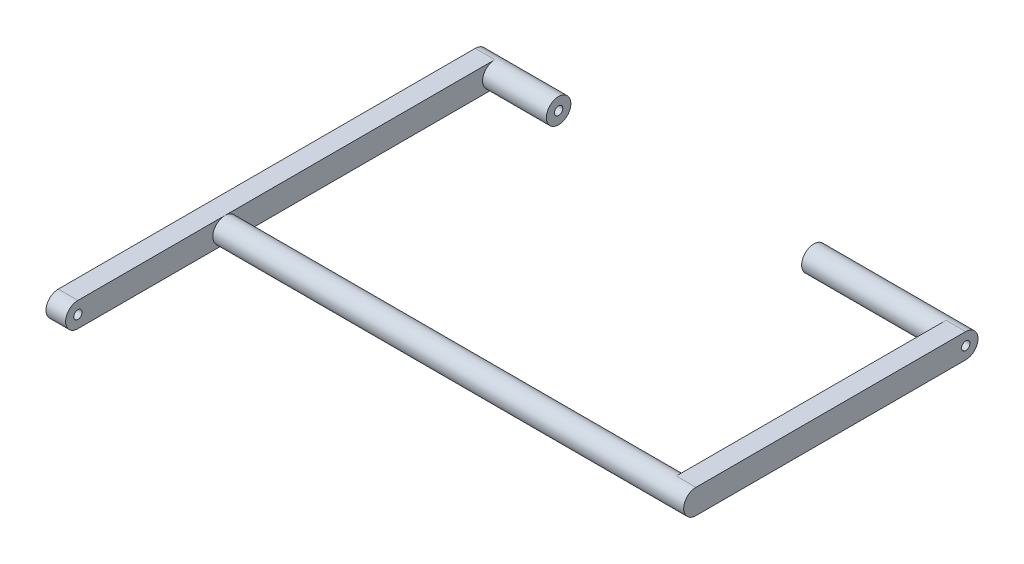
ISO-10303-21;
HEADER;
FILE_DESCRIPTION(('STEP AP214'),'2;1');
FILE_NAME('part.step','',(''),(''),'','','');
FILE_SCHEMA(('AUTOMOTIVE_DESIGN { 1 0 10303 214 1 1 1 1 }'));
ENDSEC;
DATA;
#1=APPLICATION_CONTEXT('core data for automotive mechanical design processes');
#2=APPLICATION_PROTOCOL_DEFINITION('international standard','automotive_design',2000,#1);
#3=PRODUCT_CONTEXT('',#1,'mechanical');
#4=PRODUCT('Part','Part','',(#3));
#5=PRODUCT_RELATED_PRODUCT_CATEGORY('part','',(#4));
#6=PRODUCT_DEFINITION_FORMATION('','',#4);
#7=PRODUCT_DEFINITION_CONTEXT('part definition',#1,'design');
#8=PRODUCT_DEFINITION('design','',#6,#7);
#9=PRODUCT_DEFINITION_SHAPE('','',#8);
#10=(LENGTH_UNIT() NAMED_UNIT(*) SI_UNIT(.MILLI.,.METRE.));
#11=(NAMED_UNIT(*) PLANE_ANGLE_UNIT() SI_UNIT($,.RADIAN.));
#12=(NAMED_UNIT(*) SI_UNIT($,.STERADIAN.) SOLID_ANGLE_UNIT());
#13=UNCERTAINTY_MEASURE_WITH_UNIT(LENGTH_MEASURE(1.E-05),#10,'distance_accuracy_value','');
#14=(GEOMETRIC_REPRESENTATION_CONTEXT(3) GLOBAL_UNCERTAINTY_ASSIGNED_CONTEXT((#13)) GLOBAL_UNIT_ASSIGNED_CONTEXT((#10,
#11,#12)) REPRESENTATION_CONTEXT('',''));
#15=CARTESIAN_POINT('',(0.,0.,0.));
#16=DIRECTION('',(0.,0.,1.));
#17=DIRECTION('',(1.,0.,0.));
#18=AXIS2_PLACEMENT_3D('',#15,#16,#17);
#19=CARTESIAN_POINT('',(4.,0.,27.5));
#20=DIRECTION('',(-1.,0.,0.));
#21=DIRECTION('',(0.,0.,1.));
#22=AXIS2_PLACEMENT_3D('',#19,#20,#21);
#23=CYLINDRICAL_SURFACE('',#22,2.5);
#24=DIRECTION('',(-1.,0.,0.));
#25=VECTOR('',#24,1.);
#26=CARTESIAN_POINT('',(4.,2.5,27.5));
#27=LINE('',#26,#25);
#28=CARTESIAN_POINT('',(4.,2.5,27.5));
#29=VERTEX_POINT('',#28);
#30=CARTESIAN_POINT('',(0.,2.5,27.5));
#31=VERTEX_POINT('',#30);
#32=EDGE_CURVE('E97',#29,#31,#27,.T.);
#33=ORIENTED_EDGE('',*,*,#32,.T.);
#34=CARTESIAN_POINT('',(0.,0.,27.5));
#35=DIRECTION('',(-1.,0.,0.));
#36=DIRECTION('',(0.,0.,1.));
#37=AXIS2_PLACEMENT_3D('',#34,#35,#36);
#38=CIRCLE('',#37,2.5);
#39=CARTESIAN_POINT('',(0.,-2.5,27.5));
#40=VERTEX_POINT('',#39);
#41=EDGE_CURVE('E173',#31,#40,#38,.T.);
#42=ORIENTED_EDGE('',*,*,#41,.T.);
#43=DIRECTION('',(-1.,0.,0.));
#44=VECTOR('',#43,1.);
#45=CARTESIAN_POINT('',(4.,-2.5,27.5));
#46=LINE('',#45,#44);
#47=CARTESIAN_POINT('',(4.,-2.5,27.5));
#48=VERTEX_POINT('',#47);
#49=EDGE_CURVE('E41',#48,#40,#46,.T.);
#50=ORIENTED_EDGE('',*,*,#49,.F.);
#51=CARTESIAN_POINT('',(4.,0.,27.5));
#52=DIRECTION('',(1.,0.,0.));
#53=DIRECTION('',(0.,0.,-1.));
#54=AXIS2_PLACEMENT_3D('',#51,#52,#53);
#55=CIRCLE('',#54,2.5);
#56=EDGE_CURVE('E83',#29,#48,#55,.T.);
#57=ORIENTED_EDGE('',*,*,#56,.F.);
#58=EDGE_LOOP('',(#33,#42,#50,#57));
#59=FACE_BOUND('',#58,.T.);
#60=CARTESIAN_POINT('',(-92.,0.,27.5));
#61=DIRECTION('',(-1.,0.,0.));
#62=DIRECTION('',(0.,0.,1.));
#63=AXIS2_PLACEMENT_3D('',#60,#61,#62);
#64=CIRCLE('',#63,2.5);
#65=CARTESIAN_POINT('',(-92.,2.5,27.5));
#66=VERTEX_POINT('',#65);
#67=CARTESIAN_POINT('',(-92.,-2.5,27.5));
#68=VERTEX_POINT('',#67);
#69=EDGE_CURVE('E174',#66,#68,#64,.T.);
#70=ORIENTED_EDGE('',*,*,#69,.F.);
#71=CARTESIAN_POINT('',(-92.,0.,27.5));
#72=DIRECTION('',(1.,0.,0.));
#73=DIRECTION('',(0.,0.,-1.));
#74=AXIS2_PLACEMENT_3D('',#71,#72,#73);
#75=CIRCLE('',#74,2.5);
#76=EDGE_CURVE('E141',#66,#68,#75,.T.);
#77=ORIENTED_EDGE('',*,*,#76,.T.);
#78=EDGE_LOOP('',(#70,#77));
#79=FACE_BOUND('',#78,.T.);
#80=ADVANCED_FACE('F32',(#59,#79),#23,.T.);
#81=CARTESIAN_POINT('',(4.,-2.5,27.5));
#82=DIRECTION('',(0.,1.,0.));
#83=DIRECTION('',(0.,0.,1.));
#84=AXIS2_PLACEMENT_3D('',#81,#82,#83);
#85=PLANE('',#84);
#86=DIRECTION('',(0.,0.,-1.));
#87=VECTOR('',#86,1.);
#88=CARTESIAN_POINT('',(0.,-2.5,27.5));
#89=LINE('',#88,#87);
#90=CARTESIAN_POINT('',(0.,-2.49999999999999,-27.5));
#91=VERTEX_POINT('',#90);
#92=EDGE_CURVE('E90',#40,#91,#89,.T.);
#93=ORIENTED_EDGE('',*,*,#92,.T.);
#94=DIRECTION('',(-1.,0.,0.));
#95=VECTOR('',#94,1.);
#96=CARTESIAN_POINT('',(4.,-2.49999999999999,-27.5));
#97=LINE('',#96,#95);
#98=CARTESIAN_POINT('',(4.,-2.49999999999999,-27.5));
#99=VERTEX_POINT('',#98);
#100=EDGE_CURVE('E88',#99,#91,#97,.T.);
#101=ORIENTED_EDGE('',*,*,#100,.F.);
#102=DIRECTION('',(0.,0.,-1.));
#103=VECTOR('',#102,1.);
#104=CARTESIAN_POINT('',(4.,-2.5,27.5));
#105=LINE('',#104,#103);
#106=EDGE_CURVE('E76',#48,#99,#105,.T.);
#107=ORIENTED_EDGE('',*,*,#106,.F.);
#108=ORIENTED_EDGE('',*,*,#49,.T.);
#109=EDGE_LOOP('',(#93,#101,#107,#108));
#110=FACE_BOUND('',#109,.T.);
#111=ADVANCED_FACE('F89',(#110),#85,.F.);
#112=CARTESIAN_POINT('',(4.,0.,-27.5));
#113=DIRECTION('',(-1.,0.,0.));
#114=DIRECTION('',(0.,0.,1.));
#115=AXIS2_PLACEMENT_3D('',#112,#113,#114);
#116=CYLINDRICAL_SURFACE('',#115,2.5);
#117=ORIENTED_EDGE('',*,*,#100,.T.);
#118=CARTESIAN_POINT('',(0.,0.,-27.5));
#119=DIRECTION('',(-1.,0.,0.));
#120=DIRECTION('',(0.,0.,1.));
#121=AXIS2_PLACEMENT_3D('',#118,#119,#120);
#122=CIRCLE('',#121,2.5);
#123=CARTESIAN_POINT('',(0.,2.50000000000001,-27.5));
#124=VERTEX_POINT('',#123);
#125=EDGE_CURVE('E11',#91,#124,#122,.T.);
#126=ORIENTED_EDGE('',*,*,#125,.T.);
#127=DIRECTION('',(-1.,0.,0.));
#128=VECTOR('',#127,1.);
#129=CARTESIAN_POINT('',(4.,2.50000000000001,-27.5));
#130=LINE('',#129,#128);
#131=CARTESIAN_POINT('',(4.,2.50000000000001,-27.5));
#132=VERTEX_POINT('',#131);
#133=EDGE_CURVE('E92',#132,#124,#130,.T.);
#134=ORIENTED_EDGE('',*,*,#133,.F.);
#135=CARTESIAN_POINT('',(4.,0.,-27.5));
#136=DIRECTION('',(1.,0.,0.));
#137=DIRECTION('',(0.,0.,-1.));
#138=AXIS2_PLACEMENT_3D('',#135,#136,#137);
#139=CIRCLE('',#138,2.5);
#140=EDGE_CURVE('E80',#99,#132,#139,.T.);
#141=ORIENTED_EDGE('',*,*,#140,.F.);
#142=EDGE_LOOP('',(#117,#126,#134,#141));
#143=FACE_BOUND('',#142,.T.);
#144=CARTESIAN_POINT('',(-26.96,0.,-27.5));
#145=DIRECTION('',(-1.,0.,0.));
#146=DIRECTION('',(0.,0.,1.));
#147=AXIS2_PLACEMENT_3D('',#144,#145,#146);
#148=CIRCLE('',#147,2.5);
#149=CARTESIAN_POINT('',(-26.96,0.,-25.));
#150=VERTEX_POINT('',#149);
#151=EDGE_CURVE('E102',#150,#150,#148,.T.);
#152=ORIENTED_EDGE('',*,*,#151,.F.);
#153=EDGE_LOOP('',(#152));
#154=FACE_BOUND('',#153,.T.);
#155=ADVANCED_FACE('F94',(#143,#154),#116,.T.);
#156=CARTESIAN_POINT('',(4.,2.5,27.5));
#157=DIRECTION('',(0.,-1.,0.));
#158=DIRECTION('',(0.,0.,-1.));
#159=AXIS2_PLACEMENT_3D('',#156,#157,#158);
#160=PLANE('',#159);
#161=DIRECTION('',(0.,0.,1.));
#162=VECTOR('',#161,1.);
#163=CARTESIAN_POINT('',(0.,2.5,27.5));
#164=LINE('',#163,#162);
#165=EDGE_CURVE('E67',#124,#31,#164,.T.);
#166=ORIENTED_EDGE('',*,*,#165,.T.);
#167=ORIENTED_EDGE('',*,*,#32,.F.);
#168=DIRECTION('',(0.,0.,1.));
#169=VECTOR('',#168,1.);
#170=CARTESIAN_POINT('',(4.,2.5,27.5));
#171=LINE('',#170,#169);
#172=EDGE_CURVE('E50',#132,#29,#171,.T.);
#173=ORIENTED_EDGE('',*,*,#172,.F.);
#174=ORIENTED_EDGE('',*,*,#133,.T.);
#175=EDGE_LOOP('',(#166,#167,#173,#174));
#176=FACE_BOUND('',#175,.T.);
#177=ADVANCED_FACE('F184',(#176),#160,.F.);
#178=CARTESIAN_POINT('',(4.,0.,27.5));
#179=DIRECTION('',(1.,0.,0.));
#180=DIRECTION('',(0.,0.,-1.));
#181=AXIS2_PLACEMENT_3D('',#178,#179,#180);
#182=PLANE('',#181);
#183=CARTESIAN_POINT('',(4.,0.,-27.5));
#184=DIRECTION('',(-1.,0.,0.));
#185=DIRECTION('',(0.,0.,1.));
#186=AXIS2_PLACEMENT_3D('',#183,#184,#185);
#187=CIRCLE('',#186,0.850000000000007);
#188=CARTESIAN_POINT('',(4.,0.,-26.65));
#189=VERTEX_POINT('',#188);
#190=EDGE_CURVE('E110',#189,#189,#187,.T.);
#191=ORIENTED_EDGE('',*,*,#190,.T.);
#192=EDGE_LOOP('',(#191));
#193=FACE_BOUND('',#192,.T.);
#194=ORIENTED_EDGE('',*,*,#56,.T.);
#195=ORIENTED_EDGE('',*,*,#106,.T.);
#196=ORIENTED_EDGE('',*,*,#140,.T.);
#197=ORIENTED_EDGE('',*,*,#172,.T.);
#198=EDGE_LOOP('',(#194,#195,#196,#197));
#199=FACE_BOUND('',#198,.T.);
#200=ADVANCED_FACE('F78',(#193,#199),#182,.T.);
#201=CARTESIAN_POINT('',(0.,0.,27.5));
#202=DIRECTION('',(1.,0.,0.));
#203=DIRECTION('',(0.,0.,-1.));
#204=AXIS2_PLACEMENT_3D('',#201,#202,#203);
#205=PLANE('',#204);
#206=ORIENTED_EDGE('',*,*,#41,.F.);
#207=ORIENTED_EDGE('',*,*,#165,.F.);
#208=ORIENTED_EDGE('',*,*,#125,.F.);
#209=ORIENTED_EDGE('',*,*,#92,.F.);
#210=EDGE_LOOP('',(#206,#207,#208,#209));
#211=FACE_BOUND('',#210,.T.);
#212=ADVANCED_FACE('F272',(#211),#205,.F.);
#213=CARTESIAN_POINT('',(-26.96,0.,-27.5));
#214=DIRECTION('',(-1.,0.,0.));
#215=DIRECTION('',(0.,0.,1.));
#216=AXIS2_PLACEMENT_3D('',#213,#214,#215);
#217=PLANE('',#216);
#218=CARTESIAN_POINT('',(-26.96,0.,-27.5));
#219=DIRECTION('',(-1.,0.,0.));
#220=DIRECTION('',(0.,0.,1.));
#221=AXIS2_PLACEMENT_3D('',#218,#219,#220);
#222=CIRCLE('',#221,0.850000000000007);
#223=CARTESIAN_POINT('',(-26.96,0.,-26.65));
#224=VERTEX_POINT('',#223);
#225=EDGE_CURVE('E109',#224,#224,#222,.T.);
#226=ORIENTED_EDGE('',*,*,#225,.F.);
#227=EDGE_LOOP('',(#226));
#228=FACE_BOUND('',#227,.T.);
#229=ORIENTED_EDGE('',*,*,#151,.T.);
#230=EDGE_LOOP('',(#229));
#231=FACE_BOUND('',#230,.T.);
#232=ADVANCED_FACE('F182',(#228,#231),#217,.T.);
#233=CARTESIAN_POINT('',(-92.,0.,27.5));
#234=DIRECTION('',(-1.,0.,0.));
#235=DIRECTION('',(0.,0.,1.));
#236=AXIS2_PLACEMENT_3D('',#233,#234,#235);
#237=PLANE('',#236);
#238=CARTESIAN_POINT('',(-92.,0.,-27.5));
#239=DIRECTION('',(1.,0.,0.));
#240=DIRECTION('',(0.,0.,-1.));
#241=AXIS2_PLACEMENT_3D('',#238,#239,#240);
#242=CIRCLE('',#241,2.50000000000001);
#243=CARTESIAN_POINT('',(-92.,2.50000000000002,-27.5));
#244=VERTEX_POINT('',#243);
#245=CARTESIAN_POINT('',(-92.,-2.50000000000001,-27.5));
#246=VERTEX_POINT('',#245);
#247=EDGE_CURVE('E146',#244,#246,#242,.T.);
#248=ORIENTED_EDGE('',*,*,#247,.F.);
#249=DIRECTION('',(0.,0.,-1.));
#250=VECTOR('',#249,1.);
#251=CARTESIAN_POINT('',(-92.,2.5,27.5));
#252=LINE('',#251,#250);
#253=EDGE_CURVE('E150',#66,#244,#252,.T.);
#254=ORIENTED_EDGE('',*,*,#253,.F.);
#255=ORIENTED_EDGE('',*,*,#69,.T.);
#256=DIRECTION('',(0.,0.,1.));
#257=VECTOR('',#256,1.);
#258=CARTESIAN_POINT('',(-92.,-2.5,27.5));
#259=LINE('',#258,#257);
#260=EDGE_CURVE('E157',#246,#68,#259,.T.);
#261=ORIENTED_EDGE('',*,*,#260,.F.);
#262=EDGE_LOOP('',(#248,#254,#255,#261));
#263=FACE_BOUND('',#262,.T.);
#264=ADVANCED_FACE('F208',(#263),#237,.F.);
#265=CARTESIAN_POINT('',(-96.,2.5,27.5));
#266=DIRECTION('',(0.,-1.,0.));
#267=DIRECTION('',(0.,0.,-1.));
#268=AXIS2_PLACEMENT_3D('',#265,#266,#267);
#269=PLANE('',#268);
#270=ORIENTED_EDGE('',*,*,#253,.T.);
#271=DIRECTION('',(1.,0.,0.));
#272=VECTOR('',#271,1.);
#273=CARTESIAN_POINT('',(-96.,2.50000000000001,-27.5));
#274=LINE('',#273,#272);
#275=CARTESIAN_POINT('',(-96.,2.50000000000001,-27.5));
#276=VERTEX_POINT('',#275);
#277=EDGE_CURVE('E170',#276,#244,#274,.T.);
#278=ORIENTED_EDGE('',*,*,#277,.F.);
#279=DIRECTION('',(0.,0.,-1.));
#280=VECTOR('',#279,1.);
#281=CARTESIAN_POINT('',(-96.,2.5,27.5));
#282=LINE('',#281,#280);
#283=CARTESIAN_POINT('',(-96.,2.5,57.5));
#284=VERTEX_POINT('',#283);
#285=EDGE_CURVE('E153',#284,#276,#282,.T.);
#286=ORIENTED_EDGE('',*,*,#285,.F.);
#287=DIRECTION('',(1.,0.,0.));
#288=VECTOR('',#287,1.);
#289=CARTESIAN_POINT('',(-131.355339059327,2.5,57.5));
#290=LINE('',#289,#288);
#291=CARTESIAN_POINT('',(-92.,2.5,57.5));
#292=VERTEX_POINT('',#291);
#293=EDGE_CURVE('E129',#284,#292,#290,.T.);
#294=ORIENTED_EDGE('',*,*,#293,.T.);
#295=DIRECTION('',(0.,0.,1.));
#296=VECTOR('',#295,1.);
#297=CARTESIAN_POINT('',(-92.,2.5,27.5));
#298=LINE('',#297,#296);
#299=EDGE_CURVE('E114',#66,#292,#298,.T.);
#300=ORIENTED_EDGE('',*,*,#299,.F.);
#301=EDGE_LOOP('',(#270,#278,#286,#294,#300));
#302=FACE_BOUND('',#301,.T.);
#303=ADVANCED_FACE('F216',(#302),#269,.F.);
#304=CARTESIAN_POINT('',(-96.,0.,-27.5));
#305=DIRECTION('',(1.,0.,0.));
#306=DIRECTION('',(0.,0.,-1.));
#307=AXIS2_PLACEMENT_3D('',#304,#305,#306);
#308=CYLINDRICAL_SURFACE('',#307,2.5);
#309=ORIENTED_EDGE('',*,*,#277,.T.);
#310=ORIENTED_EDGE('',*,*,#247,.T.);
#311=DIRECTION('',(1.,0.,0.));
#312=VECTOR('',#311,1.);
#313=CARTESIAN_POINT('',(-96.,-2.50000000000001,-27.5));
#314=LINE('',#313,#312);
#315=CARTESIAN_POINT('',(-96.,-2.50000000000001,-27.5));
#316=VERTEX_POINT('',#315);
#317=EDGE_CURVE('E163',#316,#246,#314,.T.);
#318=ORIENTED_EDGE('',*,*,#317,.F.);
#319=CARTESIAN_POINT('',(-96.,0.,-27.5));
#320=DIRECTION('',(-1.,0.,0.));
#321=DIRECTION('',(0.,0.,1.));
#322=AXIS2_PLACEMENT_3D('',#319,#320,#321);
#323=CIRCLE('',#322,2.5);
#324=EDGE_CURVE('E156',#276,#316,#323,.T.);
#325=ORIENTED_EDGE('',*,*,#324,.F.);
#326=EDGE_LOOP('',(#309,#310,#318,#325));
#327=FACE_BOUND('',#326,.T.);
#328=CARTESIAN_POINT('',(-79.,0.,-27.5));
#329=DIRECTION('',(1.,0.,0.));
#330=DIRECTION('',(0.,0.,-1.));
#331=AXIS2_PLACEMENT_3D('',#328,#329,#330);
#332=CIRCLE('',#331,2.50000000000001);
#333=CARTESIAN_POINT('',(-79.,0.,-30.));
#334=VERTEX_POINT('',#333);
#335=EDGE_CURVE('E147',#334,#334,#332,.T.);
#336=ORIENTED_EDGE('',*,*,#335,.F.);
#337=EDGE_LOOP('',(#336));
#338=FACE_BOUND('',#337,.T.);
#339=ADVANCED_FACE('F244',(#327,#338),#308,.T.);
#340=CARTESIAN_POINT('',(-96.,-2.5,27.5));
#341=DIRECTION('',(0.,1.,0.));
#342=DIRECTION('',(0.,0.,1.));
#343=AXIS2_PLACEMENT_3D('',#340,#341,#342);
#344=PLANE('',#343);
#345=ORIENTED_EDGE('',*,*,#260,.T.);
#346=DIRECTION('',(0.,0.,-1.));
#347=VECTOR('',#346,1.);
#348=CARTESIAN_POINT('',(-92.,-2.5,27.5));
#349=LINE('',#348,#347);
#350=CARTESIAN_POINT('',(-92.,-2.5,57.5));
#351=VERTEX_POINT('',#350);
#352=EDGE_CURVE('E126',#351,#68,#349,.T.);
#353=ORIENTED_EDGE('',*,*,#352,.F.);
#354=DIRECTION('',(1.,0.,0.));
#355=VECTOR('',#354,1.);
#356=CARTESIAN_POINT('',(-131.355339059327,-2.5,57.5));
#357=LINE('',#356,#355);
#358=CARTESIAN_POINT('',(-96.,-2.5,57.5));
#359=VERTEX_POINT('',#358);
#360=EDGE_CURVE('E138',#359,#351,#357,.T.);
#361=ORIENTED_EDGE('',*,*,#360,.F.);
#362=DIRECTION('',(0.,0.,1.));
#363=VECTOR('',#362,1.);
#364=CARTESIAN_POINT('',(-96.,-2.5,27.5));
#365=LINE('',#364,#363);
#366=EDGE_CURVE('E160',#316,#359,#365,.T.);
#367=ORIENTED_EDGE('',*,*,#366,.F.);
#368=ORIENTED_EDGE('',*,*,#317,.T.);
#369=EDGE_LOOP('',(#345,#353,#361,#367,#368));
#370=FACE_BOUND('',#369,.T.);
#371=ADVANCED_FACE('F229',(#370),#344,.F.);
#372=CARTESIAN_POINT('',(-96.,0.,27.5));
#373=DIRECTION('',(-1.,0.,0.));
#374=DIRECTION('',(0.,0.,1.));
#375=AXIS2_PLACEMENT_3D('',#372,#373,#374);
#376=PLANE('',#375);
#377=CARTESIAN_POINT('',(-96.,0.,57.5));
#378=DIRECTION('',(-1.,0.,0.));
#379=DIRECTION('',(0.,0.,1.));
#380=AXIS2_PLACEMENT_3D('',#377,#378,#379);
#381=CIRCLE('',#380,0.850000000000007);
#382=CARTESIAN_POINT('',(-96.,0.,58.35));
#383=VERTEX_POINT('',#382);
#384=EDGE_CURVE('E122',#383,#383,#381,.T.);
#385=ORIENTED_EDGE('',*,*,#384,.F.);
#386=EDGE_LOOP('',(#385));
#387=FACE_BOUND('',#386,.T.);
#388=CARTESIAN_POINT('',(-96.,0.,-27.5));
#389=DIRECTION('',(-1.,0.,0.));
#390=DIRECTION('',(0.,0.,1.));
#391=AXIS2_PLACEMENT_3D('',#388,#389,#390);
#392=CIRCLE('',#391,0.850000000000007);
#393=CARTESIAN_POINT('',(-96.,0.,-26.65));
#394=VERTEX_POINT('',#393);
#395=EDGE_CURVE('E117',#394,#394,#392,.T.);
#396=ORIENTED_EDGE('',*,*,#395,.F.);
#397=EDGE_LOOP('',(#396));
#398=FACE_BOUND('',#397,.T.);
#399=ORIENTED_EDGE('',*,*,#366,.T.);
#400=CARTESIAN_POINT('',(-96.,0.,57.5));
#401=DIRECTION('',(-1.,0.,0.));
#402=DIRECTION('',(0.,0.,1.));
#403=AXIS2_PLACEMENT_3D('',#400,#401,#402);
#404=CIRCLE('',#403,2.5);
#405=EDGE_CURVE('E135',#284,#359,#404,.F.);
#406=ORIENTED_EDGE('',*,*,#405,.F.);
#407=ORIENTED_EDGE('',*,*,#285,.T.);
#408=ORIENTED_EDGE('',*,*,#324,.T.);
#409=EDGE_LOOP('',(#399,#406,#407,#408));
#410=FACE_BOUND('',#409,.T.);
#411=ADVANCED_FACE('F242',(#387,#398,#410),#376,.T.);
#412=CARTESIAN_POINT('',(-79.,0.,-27.5));
#413=DIRECTION('',(1.,0.,0.));
#414=DIRECTION('',(0.,0.,-1.));
#415=AXIS2_PLACEMENT_3D('',#412,#413,#414);
#416=PLANE('',#415);
#417=CARTESIAN_POINT('',(-79.,0.,-27.5));
#418=DIRECTION('',(1.,0.,0.));
#419=DIRECTION('',(0.,0.,-1.));
#420=AXIS2_PLACEMENT_3D('',#417,#418,#419);
#421=CIRCLE('',#420,0.850000000000007);
#422=CARTESIAN_POINT('',(-79.,0.,-26.65));
#423=VERTEX_POINT('',#422);
#424=EDGE_CURVE('E107',#423,#423,#421,.T.);
#425=ORIENTED_EDGE('',*,*,#424,.F.);
#426=EDGE_LOOP('',(#425));
#427=FACE_BOUND('',#426,.T.);
#428=ORIENTED_EDGE('',*,*,#335,.T.);
#429=EDGE_LOOP('',(#428));
#430=FACE_BOUND('',#429,.T.);
#431=ADVANCED_FACE('F250',(#427,#430),#416,.T.);
#432=CARTESIAN_POINT('',(-92.,0.,27.5));
#433=DIRECTION('',(1.,0.,0.));
#434=DIRECTION('',(0.,0.,-1.));
#435=AXIS2_PLACEMENT_3D('',#432,#433,#434);
#436=PLANE('',#435);
#437=CARTESIAN_POINT('',(-92.,0.,57.5));
#438=DIRECTION('',(1.,0.,0.));
#439=DIRECTION('',(0.,0.,-1.));
#440=AXIS2_PLACEMENT_3D('',#437,#438,#439);
#441=CIRCLE('',#440,0.850000000000007);
#442=CARTESIAN_POINT('',(-92.,0.,56.65));
#443=VERTEX_POINT('',#442);
#444=EDGE_CURVE('E35',#443,#443,#441,.T.);
#445=ORIENTED_EDGE('',*,*,#444,.F.);
#446=EDGE_LOOP('',(#445));
#447=FACE_BOUND('',#446,.T.);
#448=ORIENTED_EDGE('',*,*,#76,.F.);
#449=ORIENTED_EDGE('',*,*,#299,.T.);
#450=CARTESIAN_POINT('',(-92.,0.,57.5));
#451=DIRECTION('',(1.,0.,0.));
#452=DIRECTION('',(0.,0.,-1.));
#453=AXIS2_PLACEMENT_3D('',#450,#451,#452);
#454=CIRCLE('',#453,2.5);
#455=EDGE_CURVE('E130',#292,#351,#454,.T.);
#456=ORIENTED_EDGE('',*,*,#455,.T.);
#457=ORIENTED_EDGE('',*,*,#352,.T.);
#458=EDGE_LOOP('',(#448,#449,#456,#457));
#459=FACE_BOUND('',#458,.T.);
#460=ADVANCED_FACE('F213',(#447,#459),#436,.T.);
#461=CARTESIAN_POINT('',(-131.355339059327,0.,57.5));
#462=DIRECTION('',(1.,0.,0.));
#463=DIRECTION('',(0.,0.,-1.));
#464=AXIS2_PLACEMENT_3D('',#461,#462,#463);
#465=CYLINDRICAL_SURFACE('',#464,2.5);
#466=ORIENTED_EDGE('',*,*,#293,.F.);
#467=ORIENTED_EDGE('',*,*,#405,.T.);
#468=ORIENTED_EDGE('',*,*,#360,.T.);
#469=ORIENTED_EDGE('',*,*,#455,.F.);
#470=EDGE_LOOP('',(#466,#467,#468,#469));
#471=FACE_BOUND('',#470,.T.);
#472=ADVANCED_FACE('F225',(#471),#465,.T.);
#473=CARTESIAN_POINT('',(4.,0.,-27.5));
#474=DIRECTION('',(-1.,0.,0.));
#475=DIRECTION('',(0.,0.,1.));
#476=AXIS2_PLACEMENT_3D('',#473,#474,#475);
#477=CYLINDRICAL_SURFACE('',#476,0.850000000000007);
#478=CARTESIAN_POINT('',(-79.,0.,-26.65));
#479=CARTESIAN_POINT('',(-79.1770833333333,0.,-26.65));
#480=CARTESIAN_POINT('',(-79.3541666666667,0.,-26.65));
#481=CARTESIAN_POINT('',(-79.7083333333333,0.,-26.65));
#482=CARTESIAN_POINT('',(-79.8854166666667,0.,-26.65));
#483=CARTESIAN_POINT('',(-80.2395833333333,0.,-26.65));
#484=CARTESIAN_POINT('',(-80.4166666666667,0.,-26.65));
#485=CARTESIAN_POINT('',(-80.7708333333333,0.,-26.65));
#486=CARTESIAN_POINT('',(-80.9479166666667,0.,-26.65));
#487=CARTESIAN_POINT('',(-81.3020833333333,0.,-26.65));
#488=CARTESIAN_POINT('',(-81.4791666666667,0.,-26.65));
#489=CARTESIAN_POINT('',(-81.8333333333333,0.,-26.65));
#490=CARTESIAN_POINT('',(-82.0104166666667,0.,-26.65));
#491=CARTESIAN_POINT('',(-82.3645833333333,0.,-26.65));
#492=CARTESIAN_POINT('',(-82.5416666666667,0.,-26.65));
#493=CARTESIAN_POINT('',(-82.8958333333333,0.,-26.65));
#494=CARTESIAN_POINT('',(-83.0729166666667,0.,-26.65));
#495=CARTESIAN_POINT('',(-83.4270833333333,0.,-26.65));
#496=CARTESIAN_POINT('',(-83.6041666666667,0.,-26.65));
#497=CARTESIAN_POINT('',(-83.9583333333333,0.,-26.65));
#498=CARTESIAN_POINT('',(-84.1354166666667,0.,-26.65));
#499=CARTESIAN_POINT('',(-84.4895833333333,0.,-26.65));
#500=CARTESIAN_POINT('',(-84.6666666666667,0.,-26.65));
#501=CARTESIAN_POINT('',(-85.0208333333333,0.,-26.65));
#502=CARTESIAN_POINT('',(-85.1979166666667,0.,-26.65));
#503=CARTESIAN_POINT('',(-85.5520833333333,0.,-26.65));
#504=CARTESIAN_POINT('',(-85.7291666666667,0.,-26.65));
#505=CARTESIAN_POINT('',(-86.0833333333333,0.,-26.65));
#506=CARTESIAN_POINT('',(-86.2604166666667,0.,-26.65));
#507=CARTESIAN_POINT('',(-86.6145833333333,0.,-26.65));
#508=CARTESIAN_POINT('',(-86.7916666666667,0.,-26.65));
#509=CARTESIAN_POINT('',(-87.1458333333333,0.,-26.65));
#510=CARTESIAN_POINT('',(-87.3229166666667,0.,-26.65));
#511=CARTESIAN_POINT('',(-87.6770833333333,0.,-26.65));
#512=CARTESIAN_POINT('',(-87.8541666666667,0.,-26.65));
#513=CARTESIAN_POINT('',(-88.2083333333333,0.,-26.65));
#514=CARTESIAN_POINT('',(-88.3854166666667,0.,-26.65));
#515=CARTESIAN_POINT('',(-88.7395833333333,0.,-26.65));
#516=CARTESIAN_POINT('',(-88.9166666666667,0.,-26.65));
#517=CARTESIAN_POINT('',(-89.2708333333333,0.,-26.65));
#518=CARTESIAN_POINT('',(-89.4479166666667,0.,-26.65));
#519=CARTESIAN_POINT('',(-89.8020833333333,0.,-26.65));
#520=CARTESIAN_POINT('',(-89.9791666666667,0.,-26.65));
#521=CARTESIAN_POINT('',(-90.3333333333333,0.,-26.65));
#522=CARTESIAN_POINT('',(-90.5104166666667,0.,-26.65));
#523=CARTESIAN_POINT('',(-90.8645833333333,0.,-26.65));
#524=CARTESIAN_POINT('',(-91.0416666666667,0.,-26.65));
#525=CARTESIAN_POINT('',(-91.3958333333333,0.,-26.65));
#526=CARTESIAN_POINT('',(-91.5729166666667,0.,-26.65));
#527=CARTESIAN_POINT('',(-91.9270833333333,0.,-26.65));
#528=CARTESIAN_POINT('',(-92.1041666666667,0.,-26.65));
#529=CARTESIAN_POINT('',(-92.4583333333333,0.,-26.65));
#530=CARTESIAN_POINT('',(-92.6354166666667,0.,-26.65));
#531=CARTESIAN_POINT('',(-92.9895833333333,0.,-26.65));
#532=CARTESIAN_POINT('',(-93.1666666666667,0.,-26.65));
#533=CARTESIAN_POINT('',(-93.5208333333333,0.,-26.65));
#534=CARTESIAN_POINT('',(-93.6979166666667,0.,-26.65));
#535=CARTESIAN_POINT('',(-94.0520833333333,0.,-26.65));
#536=CARTESIAN_POINT('',(-94.2291666666667,0.,-26.65));
#537=CARTESIAN_POINT('',(-94.5833333333333,0.,-26.65));
#538=CARTESIAN_POINT('',(-94.7604166666667,0.,-26.65));
#539=CARTESIAN_POINT('',(-95.1145833333333,0.,-26.65));
#540=CARTESIAN_POINT('',(-95.2916666666667,0.,-26.65));
#541=CARTESIAN_POINT('',(-95.6458333333333,0.,-26.65));
#542=CARTESIAN_POINT('',(-95.8229166666667,0.,-26.65));
#543=CARTESIAN_POINT('',(-96.,0.,-26.65));
#544=B_SPLINE_CURVE_WITH_KNOTS('',3,(#478,#479,#480,#481,#482,#483,#484,#485,#486,#487,#488,
#489,#490,#491,#492,#493,#494,#495,#496,#497,#498,#499,#500,#501,#502,#503,#504,#505,#506,#507,
#508,#509,#510,#511,#512,#513,#514,#515,#516,#517,#518,#519,#520,#521,#522,#523,#524,#525,#526,
#527,#528,#529,#530,#531,#532,#533,#534,#535,#536,#537,#538,#539,#540,#541,#542,#543),
.UNSPECIFIED.,.F.,.F.,(4,2,2,2,2,2,2,2,2,2,2,2,2,2,2,2,2,2,2,2,2,2,2,2,2,2,2,2,2,2,2,2,4),(0.,
0.531249999999997,1.06249999999999,1.59375,2.125,2.65625,3.1875,3.71874999999999,4.25,4.78125,
5.3125,5.84374999999999,6.37499999999999,6.90624999999999,7.4375,7.96875,8.49999999999999,
9.03124999999999,9.56249999999999,10.09375,10.625,11.15625,11.6875,12.21875,12.75,13.28125,
13.8125,14.34375,14.875,15.40625,15.9375,16.46875,17.),.UNSPECIFIED.);
#545=EDGE_CURVE('BSEAM338',#423,#394,#544,.T.);
#546=ORIENTED_EDGE('',*,*,#424,.T.);
#547=ORIENTED_EDGE('',*,*,#395,.T.);
#548=ORIENTED_EDGE('',*,*,#545,.T.);
#549=ORIENTED_EDGE('',*,*,#545,.F.);
#550=EDGE_LOOP('',(#546,#548,#547,#549));
#551=FACE_BOUND('',#550,.T.);
#552=ADVANCED_FACE('F338',(#551),#477,.F.);
#553=CARTESIAN_POINT('',(-26.96,0.,-26.65));
#554=CARTESIAN_POINT('',(-26.6375,0.,-26.65));
#555=CARTESIAN_POINT('',(-26.315,0.,-26.65));
#556=CARTESIAN_POINT('',(-25.67,0.,-26.65));
#557=CARTESIAN_POINT('',(-25.3475,0.,-26.65));
#558=CARTESIAN_POINT('',(-24.7025,0.,-26.65));
#559=CARTESIAN_POINT('',(-24.38,0.,-26.65));
#560=CARTESIAN_POINT('',(-23.735,0.,-26.65));
#561=CARTESIAN_POINT('',(-23.4125,0.,-26.65));
#562=CARTESIAN_POINT('',(-22.7675,0.,-26.65));
#563=CARTESIAN_POINT('',(-22.445,0.,-26.65));
#564=CARTESIAN_POINT('',(-21.8,0.,-26.65));
#565=CARTESIAN_POINT('',(-21.4775,0.,-26.65));
#566=CARTESIAN_POINT('',(-20.8325,0.,-26.65));
#567=CARTESIAN_POINT('',(-20.51,0.,-26.65));
#568=CARTESIAN_POINT('',(-19.865,0.,-26.65));
#569=CARTESIAN_POINT('',(-19.5425,0.,-26.65));
#570=CARTESIAN_POINT('',(-18.8975,0.,-26.65));
#571=CARTESIAN_POINT('',(-18.575,0.,-26.65));
#572=CARTESIAN_POINT('',(-17.93,0.,-26.65));
#573=CARTESIAN_POINT('',(-17.6075,0.,-26.65));
#574=CARTESIAN_POINT('',(-16.9625,0.,-26.65));
#575=CARTESIAN_POINT('',(-16.64,0.,-26.65));
#576=CARTESIAN_POINT('',(-15.995,0.,-26.65));
#577=CARTESIAN_POINT('',(-15.6725,0.,-26.65));
#578=CARTESIAN_POINT('',(-15.0275,0.,-26.65));
#579=CARTESIAN_POINT('',(-14.705,0.,-26.65));
#580=CARTESIAN_POINT('',(-14.06,0.,-26.65));
#581=CARTESIAN_POINT('',(-13.7375,0.,-26.65));
#582=CARTESIAN_POINT('',(-13.0925,0.,-26.65));
#583=CARTESIAN_POINT('',(-12.77,0.,-26.65));
#584=CARTESIAN_POINT('',(-12.125,0.,-26.65));
#585=CARTESIAN_POINT('',(-11.8025,0.,-26.65));
#586=CARTESIAN_POINT('',(-11.1575,0.,-26.65));
#587=CARTESIAN_POINT('',(-10.835,0.,-26.65));
#588=CARTESIAN_POINT('',(-10.19,0.,-26.65));
#589=CARTESIAN_POINT('',(-9.8675,0.,-26.65));
#590=CARTESIAN_POINT('',(-9.2225,0.,-26.65));
#591=CARTESIAN_POINT('',(-8.9,0.,-26.65));
#592=CARTESIAN_POINT('',(-8.255,0.,-26.65));
#593=CARTESIAN_POINT('',(-7.9325,0.,-26.65));
#594=CARTESIAN_POINT('',(-7.2875,0.,-26.65));
#595=CARTESIAN_POINT('',(-6.965,0.,-26.65));
#596=CARTESIAN_POINT('',(-6.32,0.,-26.65));
#597=CARTESIAN_POINT('',(-5.9975,0.,-26.65));
#598=CARTESIAN_POINT('',(-5.3525,0.,-26.65));
#599=CARTESIAN_POINT('',(-5.03,0.,-26.65));
#600=CARTESIAN_POINT('',(-4.385,0.,-26.65));
#601=CARTESIAN_POINT('',(-4.0625,0.,-26.65));
#602=CARTESIAN_POINT('',(-3.4175,0.,-26.65));
#603=CARTESIAN_POINT('',(-3.095,0.,-26.65));
#604=CARTESIAN_POINT('',(-2.45,0.,-26.65));
#605=CARTESIAN_POINT('',(-2.1275,0.,-26.65));
#606=CARTESIAN_POINT('',(-1.4825,0.,-26.65));
#607=CARTESIAN_POINT('',(-1.16,0.,-26.65));
#608=CARTESIAN_POINT('',(-0.515,0.,-26.65));
#609=CARTESIAN_POINT('',(-0.192499999999999,0.,-26.65));
#610=CARTESIAN_POINT('',(0.452500000000002,0.,-26.65));
#611=CARTESIAN_POINT('',(0.775000000000002,0.,-26.65));
#612=CARTESIAN_POINT('',(1.42,0.,-26.65));
#613=CARTESIAN_POINT('',(1.7425,0.,-26.65));
#614=CARTESIAN_POINT('',(2.3875,0.,-26.65));
#615=CARTESIAN_POINT('',(2.71,0.,-26.65));
#616=CARTESIAN_POINT('',(3.355,0.,-26.65));
#617=CARTESIAN_POINT('',(3.6775,0.,-26.65));
#618=CARTESIAN_POINT('',(4.,0.,-26.65));
#619=B_SPLINE_CURVE_WITH_KNOTS('',3,(#553,#554,#555,#556,#557,#558,#559,#560,#561,#562,#563,
#564,#565,#566,#567,#568,#569,#570,#571,#572,#573,#574,#575,#576,#577,#578,#579,#580,#581,#582,
#583,#584,#585,#586,#587,#588,#589,#590,#591,#592,#593,#594,#595,#596,#597,#598,#599,#600,#601,
#602,#603,#604,#605,#606,#607,#608,#609,#610,#611,#612,#613,#614,#615,#616,#617,#618),
.UNSPECIFIED.,.F.,.F.,(4,2,2,2,2,2,2,2,2,2,2,2,2,2,2,2,2,2,2,2,2,2,2,2,2,2,2,2,2,2,2,2,4),(0.,
0.9675,1.935,2.9025,3.87,4.8375,5.805,6.7725,7.74,8.7075,9.675,10.6425,11.61,12.5775,13.545,
14.5125,15.48,16.4475,17.415,18.3825,19.35,20.3175,21.285,22.2525,23.22,24.1875,25.155,26.1225,
27.09,28.0575,29.025,29.9925,30.96),.UNSPECIFIED.);
#620=EDGE_CURVE('BSEAM315',#224,#189,#619,.T.);
#621=ORIENTED_EDGE('',*,*,#225,.T.);
#622=ORIENTED_EDGE('',*,*,#190,.F.);
#623=ORIENTED_EDGE('',*,*,#620,.T.);
#624=ORIENTED_EDGE('',*,*,#620,.F.);
#625=EDGE_LOOP('',(#621,#623,#622,#624));
#626=FACE_BOUND('',#625,.T.);
#627=ADVANCED_FACE('F315',(#626),#477,.F.);
#628=CARTESIAN_POINT('',(4.,0.,57.5));
#629=DIRECTION('',(-1.,0.,0.));
#630=DIRECTION('',(0.,0.,1.));
#631=AXIS2_PLACEMENT_3D('',#628,#629,#630);
#632=CYLINDRICAL_SURFACE('',#631,0.850000000000007);
#633=ORIENTED_EDGE('',*,*,#384,.T.);
#634=EDGE_LOOP('',(#633));
#635=FACE_BOUND('',#634,.T.);
#636=ORIENTED_EDGE('',*,*,#444,.T.);
#637=EDGE_LOOP('',(#636));
#638=FACE_BOUND('',#637,.T.);
#639=ADVANCED_FACE('F327',(#635,#638),#632,.F.);
#640=CLOSED_SHELL('',(#80,#111,#155,#177,#200,#212,#232,#264,#303,#339,#371,#411,#431,#460,#472,
#552,#627,#639));
#641=MANIFOLD_SOLID_BREP('B2',#640);
#642=ADVANCED_BREP_SHAPE_REPRESENTATION('',(#18,#641),#14);
#643=SHAPE_DEFINITION_REPRESENTATION(#9,#642);
ENDSEC;
END-ISO-10303-21;
